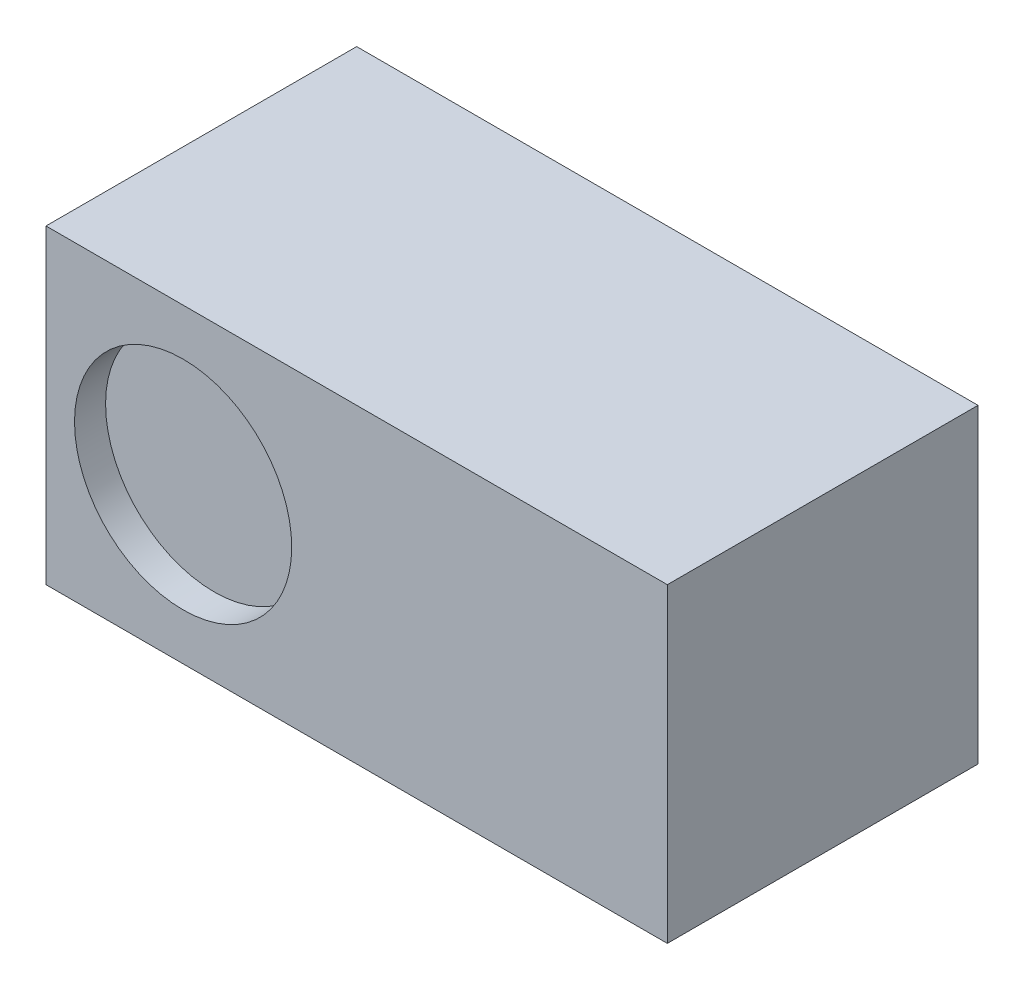
ISO-10303-21;
HEADER;
FILE_DESCRIPTION(('STEP AP214'),'2;1');
FILE_NAME('part.step','',(''),(''),'','','');
FILE_SCHEMA(('AUTOMOTIVE_DESIGN { 1 0 10303 214 1 1 1 1 }'));
ENDSEC;
DATA;
#1=APPLICATION_CONTEXT('core data for automotive mechanical design processes');
#2=APPLICATION_PROTOCOL_DEFINITION('international standard','automotive_design',2000,#1);
#3=PRODUCT_CONTEXT('',#1,'mechanical');
#4=PRODUCT('Part','Part','',(#3));
#5=PRODUCT_RELATED_PRODUCT_CATEGORY('part','',(#4));
#6=PRODUCT_DEFINITION_FORMATION('','',#4);
#7=PRODUCT_DEFINITION_CONTEXT('part definition',#1,'design');
#8=PRODUCT_DEFINITION('design','',#6,#7);
#9=PRODUCT_DEFINITION_SHAPE('','',#8);
#10=(LENGTH_UNIT() NAMED_UNIT(*) SI_UNIT(.MILLI.,.METRE.));
#11=(NAMED_UNIT(*) PLANE_ANGLE_UNIT() SI_UNIT($,.RADIAN.));
#12=(NAMED_UNIT(*) SI_UNIT($,.STERADIAN.) SOLID_ANGLE_UNIT());
#13=UNCERTAINTY_MEASURE_WITH_UNIT(LENGTH_MEASURE(1.E-05),#10,'distance_accuracy_value','');
#14=(GEOMETRIC_REPRESENTATION_CONTEXT(3) GLOBAL_UNCERTAINTY_ASSIGNED_CONTEXT((#13)) GLOBAL_UNIT_ASSIGNED_CONTEXT((#10,
#11,#12)) REPRESENTATION_CONTEXT('',''));
#15=CARTESIAN_POINT('',(0.,0.,0.));
#16=DIRECTION('',(0.,0.,1.));
#17=DIRECTION('',(1.,0.,0.));
#18=AXIS2_PLACEMENT_3D('',#15,#16,#17);
#19=CARTESIAN_POINT('',(-25.4,12.7,25.4));
#20=DIRECTION('',(1.,0.,0.));
#21=DIRECTION('',(0.,0.,-1.));
#22=AXIS2_PLACEMENT_3D('',#19,#20,#21);
#23=PLANE('',#22);
#24=DIRECTION('',(0.,-1.,0.));
#25=VECTOR('',#24,1.);
#26=CARTESIAN_POINT('',(-25.4,12.7,0.));
#27=LINE('',#26,#25);
#28=CARTESIAN_POINT('',(-25.4,12.7,0.));
#29=VERTEX_POINT('',#28);
#30=CARTESIAN_POINT('',(-25.4,-12.7,0.));
#31=VERTEX_POINT('',#30);
#32=EDGE_CURVE('E96',#29,#31,#27,.T.);
#33=ORIENTED_EDGE('',*,*,#32,.T.);
#34=DIRECTION('',(0.,0.,-1.));
#35=VECTOR('',#34,1.);
#36=CARTESIAN_POINT('',(-25.4,-12.7,25.4));
#37=LINE('',#36,#35);
#38=CARTESIAN_POINT('',(-25.4,-12.7,25.4));
#39=VERTEX_POINT('',#38);
#40=EDGE_CURVE('E11',#39,#31,#37,.T.);
#41=ORIENTED_EDGE('',*,*,#40,.F.);
#42=DIRECTION('',(0.,-1.,0.));
#43=VECTOR('',#42,1.);
#44=CARTESIAN_POINT('',(-25.4,12.7,25.4));
#45=LINE('',#44,#43);
#46=CARTESIAN_POINT('',(-25.4,12.7,25.4));
#47=VERTEX_POINT('',#46);
#48=EDGE_CURVE('E84',#47,#39,#45,.T.);
#49=ORIENTED_EDGE('',*,*,#48,.F.);
#50=DIRECTION('',(0.,0.,-1.));
#51=VECTOR('',#50,1.);
#52=CARTESIAN_POINT('',(-25.4,12.7,25.4));
#53=LINE('',#52,#51);
#54=EDGE_CURVE('E92',#47,#29,#53,.T.);
#55=ORIENTED_EDGE('',*,*,#54,.T.);
#56=EDGE_LOOP('',(#33,#41,#49,#55));
#57=FACE_BOUND('',#56,.T.);
#58=ADVANCED_FACE('F33',(#57),#23,.F.);
#59=CARTESIAN_POINT('',(-25.4,-12.7,25.4));
#60=DIRECTION('',(0.,1.,0.));
#61=DIRECTION('',(0.,0.,1.));
#62=AXIS2_PLACEMENT_3D('',#59,#60,#61);
#63=PLANE('',#62);
#64=DIRECTION('',(1.,0.,0.));
#65=VECTOR('',#64,1.);
#66=CARTESIAN_POINT('',(-25.4,-12.7,0.));
#67=LINE('',#66,#65);
#68=CARTESIAN_POINT('',(25.4,-12.7,0.));
#69=VERTEX_POINT('',#68);
#70=EDGE_CURVE('E88',#31,#69,#67,.T.);
#71=ORIENTED_EDGE('',*,*,#70,.T.);
#72=DIRECTION('',(0.,0.,-1.));
#73=VECTOR('',#72,1.);
#74=CARTESIAN_POINT('',(25.4,-12.7,25.4));
#75=LINE('',#74,#73);
#76=CARTESIAN_POINT('',(25.4,-12.7,25.4));
#77=VERTEX_POINT('',#76);
#78=EDGE_CURVE('E41',#77,#69,#75,.T.);
#79=ORIENTED_EDGE('',*,*,#78,.F.);
#80=DIRECTION('',(1.,0.,0.));
#81=VECTOR('',#80,1.);
#82=CARTESIAN_POINT('',(-25.4,-12.7,25.4));
#83=LINE('',#82,#81);
#84=EDGE_CURVE('E79',#39,#77,#83,.T.);
#85=ORIENTED_EDGE('',*,*,#84,.F.);
#86=ORIENTED_EDGE('',*,*,#40,.T.);
#87=EDGE_LOOP('',(#71,#79,#85,#86));
#88=FACE_BOUND('',#87,.T.);
#89=ADVANCED_FACE('F87',(#88),#63,.F.);
#90=CARTESIAN_POINT('',(25.4,12.7,25.4));
#91=DIRECTION('',(-1.,0.,0.));
#92=DIRECTION('',(0.,0.,1.));
#93=AXIS2_PLACEMENT_3D('',#90,#91,#92);
#94=PLANE('',#93);
#95=DIRECTION('',(0.,1.,0.));
#96=VECTOR('',#95,1.);
#97=CARTESIAN_POINT('',(25.4,12.7,0.));
#98=LINE('',#97,#96);
#99=CARTESIAN_POINT('',(25.4,12.7,0.));
#100=VERTEX_POINT('',#99);
#101=EDGE_CURVE('E66',#69,#100,#98,.T.);
#102=ORIENTED_EDGE('',*,*,#101,.T.);
#103=DIRECTION('',(0.,0.,-1.));
#104=VECTOR('',#103,1.);
#105=CARTESIAN_POINT('',(25.4,12.7,25.4));
#106=LINE('',#105,#104);
#107=CARTESIAN_POINT('',(25.4,12.7,25.4));
#108=VERTEX_POINT('',#107);
#109=EDGE_CURVE('E89',#108,#100,#106,.T.);
#110=ORIENTED_EDGE('',*,*,#109,.F.);
#111=DIRECTION('',(0.,1.,0.));
#112=VECTOR('',#111,1.);
#113=CARTESIAN_POINT('',(25.4,12.7,25.4));
#114=LINE('',#113,#112);
#115=EDGE_CURVE('E82',#77,#108,#114,.T.);
#116=ORIENTED_EDGE('',*,*,#115,.F.);
#117=ORIENTED_EDGE('',*,*,#78,.T.);
#118=EDGE_LOOP('',(#102,#110,#116,#117));
#119=FACE_BOUND('',#118,.T.);
#120=ADVANCED_FACE('F90',(#119),#94,.F.);
#121=CARTESIAN_POINT('',(-25.4,12.7,25.4));
#122=DIRECTION('',(0.,-1.,0.));
#123=DIRECTION('',(1.,0.,0.));
#124=AXIS2_PLACEMENT_3D('',#121,#122,#123);
#125=PLANE('',#124);
#126=DIRECTION('',(-1.,0.,0.));
#127=VECTOR('',#126,1.);
#128=CARTESIAN_POINT('',(-25.4,12.7,0.));
#129=LINE('',#128,#127);
#130=EDGE_CURVE('E72',#100,#29,#129,.T.);
#131=ORIENTED_EDGE('',*,*,#130,.T.);
#132=ORIENTED_EDGE('',*,*,#54,.F.);
#133=DIRECTION('',(-1.,0.,0.));
#134=VECTOR('',#133,1.);
#135=CARTESIAN_POINT('',(-25.4,12.7,25.4));
#136=LINE('',#135,#134);
#137=EDGE_CURVE('E49',#108,#47,#136,.T.);
#138=ORIENTED_EDGE('',*,*,#137,.F.);
#139=ORIENTED_EDGE('',*,*,#109,.T.);
#140=EDGE_LOOP('',(#131,#132,#138,#139));
#141=FACE_BOUND('',#140,.T.);
#142=ADVANCED_FACE('F104',(#141),#125,.F.);
#143=CARTESIAN_POINT('',(0.,0.,25.4));
#144=DIRECTION('',(0.,0.,1.));
#145=DIRECTION('',(1.,0.,0.));
#146=AXIS2_PLACEMENT_3D('',#143,#144,#145);
#147=PLANE('',#146);
#148=CARTESIAN_POINT('',(-14.18961460422,0.,25.4));
#149=DIRECTION('',(0.,0.,1.));
#150=DIRECTION('',(1.,0.,0.));
#151=AXIS2_PLACEMENT_3D('',#148,#149,#150);
#152=CIRCLE('',#151,8.87923080460916);
#153=CARTESIAN_POINT('',(-5.31038379961081,0.,25.4));
#154=VERTEX_POINT('',#153);
#155=EDGE_CURVE('E110',#154,#154,#152,.T.);
#156=ORIENTED_EDGE('',*,*,#155,.F.);
#157=EDGE_LOOP('',(#156));
#158=FACE_BOUND('',#157,.T.);
#159=ORIENTED_EDGE('',*,*,#48,.T.);
#160=ORIENTED_EDGE('',*,*,#84,.T.);
#161=ORIENTED_EDGE('',*,*,#115,.T.);
#162=ORIENTED_EDGE('',*,*,#137,.T.);
#163=EDGE_LOOP('',(#159,#160,#161,#162));
#164=FACE_BOUND('',#163,.T.);
#165=ADVANCED_FACE('F80',(#158,#164),#147,.T.);
#166=CARTESIAN_POINT('',(0.,0.,0.));
#167=DIRECTION('',(0.,0.,1.));
#168=DIRECTION('',(1.,0.,0.));
#169=AXIS2_PLACEMENT_3D('',#166,#167,#168);
#170=PLANE('',#169);
#171=ORIENTED_EDGE('',*,*,#32,.F.);
#172=ORIENTED_EDGE('',*,*,#130,.F.);
#173=ORIENTED_EDGE('',*,*,#101,.F.);
#174=ORIENTED_EDGE('',*,*,#70,.F.);
#175=EDGE_LOOP('',(#171,#172,#173,#174));
#176=FACE_BOUND('',#175,.T.);
#177=ADVANCED_FACE('F107',(#176),#170,.F.);
#178=CARTESIAN_POINT('',(-14.18961460422,0.,22.86));
#179=DIRECTION('',(0.,0.,1.));
#180=DIRECTION('',(1.,0.,0.));
#181=AXIS2_PLACEMENT_3D('',#178,#179,#180);
#182=CYLINDRICAL_SURFACE('',#181,8.87923080460916);
#183=CARTESIAN_POINT('',(-14.18961460422,0.,22.86));
#184=DIRECTION('',(0.,0.,1.));
#185=DIRECTION('',(1.,0.,0.));
#186=AXIS2_PLACEMENT_3D('',#183,#184,#185);
#187=CIRCLE('',#186,8.87923080460916);
#188=CARTESIAN_POINT('',(-5.31038379961081,0.,22.86));
#189=VERTEX_POINT('',#188);
#190=EDGE_CURVE('E99',#189,#189,#187,.T.);
#191=ORIENTED_EDGE('',*,*,#190,.F.);
#192=EDGE_LOOP('',(#191));
#193=FACE_BOUND('',#192,.T.);
#194=ORIENTED_EDGE('',*,*,#155,.T.);
#195=EDGE_LOOP('',(#194));
#196=FACE_BOUND('',#195,.T.);
#197=ADVANCED_FACE('F118',(#193,#196),#182,.F.);
#198=CARTESIAN_POINT('',(-14.18961460422,0.,22.86));
#199=DIRECTION('',(0.,0.,1.));
#200=DIRECTION('',(1.,0.,0.));
#201=AXIS2_PLACEMENT_3D('',#198,#199,#200);
#202=PLANE('',#201);
#203=ORIENTED_EDGE('',*,*,#190,.T.);
#204=EDGE_LOOP('',(#203));
#205=FACE_BOUND('',#204,.T.);
#206=ADVANCED_FACE('F116',(#205),#202,.T.);
#207=CLOSED_SHELL('',(#58,#89,#120,#142,#165,#177,#197,#206));
#208=MANIFOLD_SOLID_BREP('B2',#207);
#209=ADVANCED_BREP_SHAPE_REPRESENTATION('',(#18,#208),#14);
#210=SHAPE_DEFINITION_REPRESENTATION(#9,#209);
ENDSEC;
END-ISO-10303-21;
